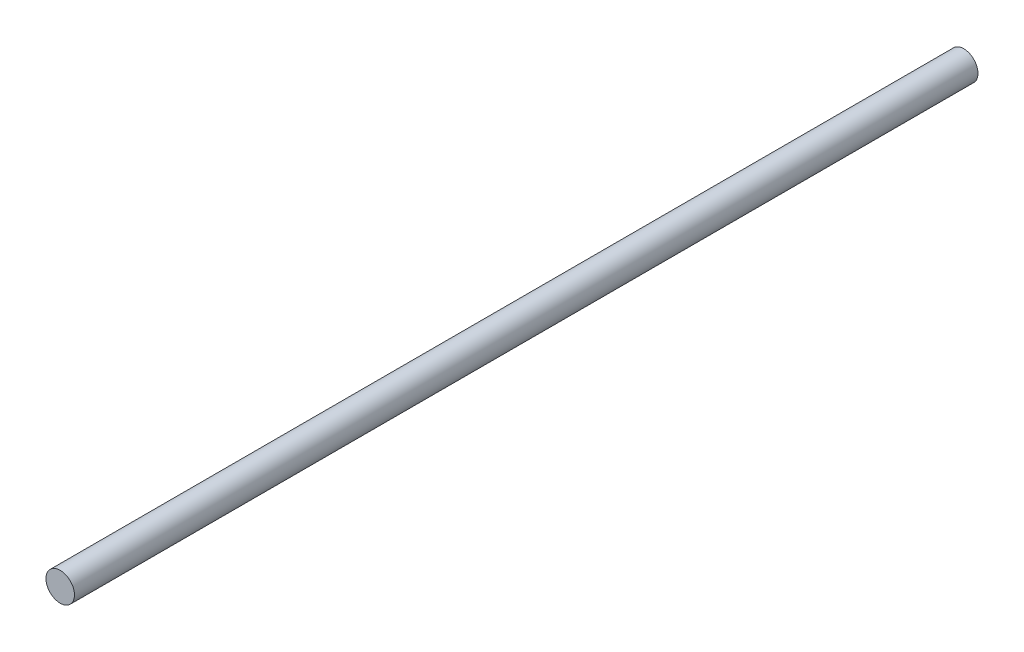
ISO-10303-21;
HEADER;
FILE_DESCRIPTION(('STEP AP214'),'2;1');
FILE_NAME('part.step','',(''),(''),'','','');
FILE_SCHEMA(('AUTOMOTIVE_DESIGN { 1 0 10303 214 1 1 1 1 }'));
ENDSEC;
DATA;
#1=APPLICATION_CONTEXT('core data for automotive mechanical design processes');
#2=APPLICATION_PROTOCOL_DEFINITION('international standard','automotive_design',2000,#1);
#3=PRODUCT_CONTEXT('',#1,'mechanical');
#4=PRODUCT('Part','Part','',(#3));
#5=PRODUCT_RELATED_PRODUCT_CATEGORY('part','',(#4));
#6=PRODUCT_DEFINITION_FORMATION('','',#4);
#7=PRODUCT_DEFINITION_CONTEXT('part definition',#1,'design');
#8=PRODUCT_DEFINITION('design','',#6,#7);
#9=PRODUCT_DEFINITION_SHAPE('','',#8);
#10=(LENGTH_UNIT() NAMED_UNIT(*) SI_UNIT(.MILLI.,.METRE.));
#11=(NAMED_UNIT(*) PLANE_ANGLE_UNIT() SI_UNIT($,.RADIAN.));
#12=(NAMED_UNIT(*) SI_UNIT($,.STERADIAN.) SOLID_ANGLE_UNIT());
#13=UNCERTAINTY_MEASURE_WITH_UNIT(LENGTH_MEASURE(1.E-05),#10,'distance_accuracy_value','');
#14=(GEOMETRIC_REPRESENTATION_CONTEXT(3) GLOBAL_UNCERTAINTY_ASSIGNED_CONTEXT((#13)) GLOBAL_UNIT_ASSIGNED_CONTEXT((#10,
#11,#12)) REPRESENTATION_CONTEXT('',''));
#15=CARTESIAN_POINT('',(0.,0.,0.));
#16=DIRECTION('',(0.,0.,1.));
#17=DIRECTION('',(1.,0.,0.));
#18=AXIS2_PLACEMENT_3D('',#15,#16,#17);
#19=CARTESIAN_POINT('',(0.,0.,158.5));
#20=DIRECTION('',(0.,0.,-1.));
#21=DIRECTION('',(-1.,0.,0.));
#22=AXIS2_PLACEMENT_3D('',#19,#20,#21);
#23=CYLINDRICAL_SURFACE('',#22,2.5);
#24=CARTESIAN_POINT('',(0.,0.,158.5));
#25=DIRECTION('',(0.,0.,1.));
#26=DIRECTION('',(1.,0.,0.));
#27=AXIS2_PLACEMENT_3D('',#24,#25,#26);
#28=CIRCLE('',#27,2.5);
#29=CARTESIAN_POINT('',(2.5,0.,158.5));
#30=VERTEX_POINT('',#29);
#31=EDGE_CURVE('E10',#30,#30,#28,.T.);
#32=ORIENTED_EDGE('',*,*,#31,.F.);
#33=EDGE_LOOP('',(#32));
#34=FACE_BOUND('',#33,.T.);
#35=CARTESIAN_POINT('',(0.,0.,0.));
#36=DIRECTION('',(0.,0.,1.));
#37=DIRECTION('',(1.,0.,0.));
#38=AXIS2_PLACEMENT_3D('',#35,#36,#37);
#39=CIRCLE('',#38,2.5);
#40=CARTESIAN_POINT('',(2.5,0.,0.));
#41=VERTEX_POINT('',#40);
#42=EDGE_CURVE('E34',#41,#41,#39,.T.);
#43=ORIENTED_EDGE('',*,*,#42,.T.);
#44=EDGE_LOOP('',(#43));
#45=FACE_BOUND('',#44,.T.);
#46=ADVANCED_FACE('F31',(#34,#45),#23,.T.);
#47=CARTESIAN_POINT('',(0.,0.,158.5));
#48=DIRECTION('',(0.,0.,1.));
#49=DIRECTION('',(1.,0.,0.));
#50=AXIS2_PLACEMENT_3D('',#47,#48,#49);
#51=PLANE('',#50);
#52=ORIENTED_EDGE('',*,*,#31,.T.);
#53=EDGE_LOOP('',(#52));
#54=FACE_BOUND('',#53,.T.);
#55=ADVANCED_FACE('F46',(#54),#51,.T.);
#56=CARTESIAN_POINT('',(0.,0.,0.));
#57=DIRECTION('',(0.,0.,1.));
#58=DIRECTION('',(1.,0.,0.));
#59=AXIS2_PLACEMENT_3D('',#56,#57,#58);
#60=PLANE('',#59);
#61=ORIENTED_EDGE('',*,*,#42,.F.);
#62=EDGE_LOOP('',(#61));
#63=FACE_BOUND('',#62,.T.);
#64=ADVANCED_FACE('F44',(#63),#60,.F.);
#65=CLOSED_SHELL('',(#46,#55,#64));
#66=MANIFOLD_SOLID_BREP('B2',#65);
#67=ADVANCED_BREP_SHAPE_REPRESENTATION('',(#18,#66),#14);
#68=SHAPE_DEFINITION_REPRESENTATION(#9,#67);
ENDSEC;
END-ISO-10303-21;
